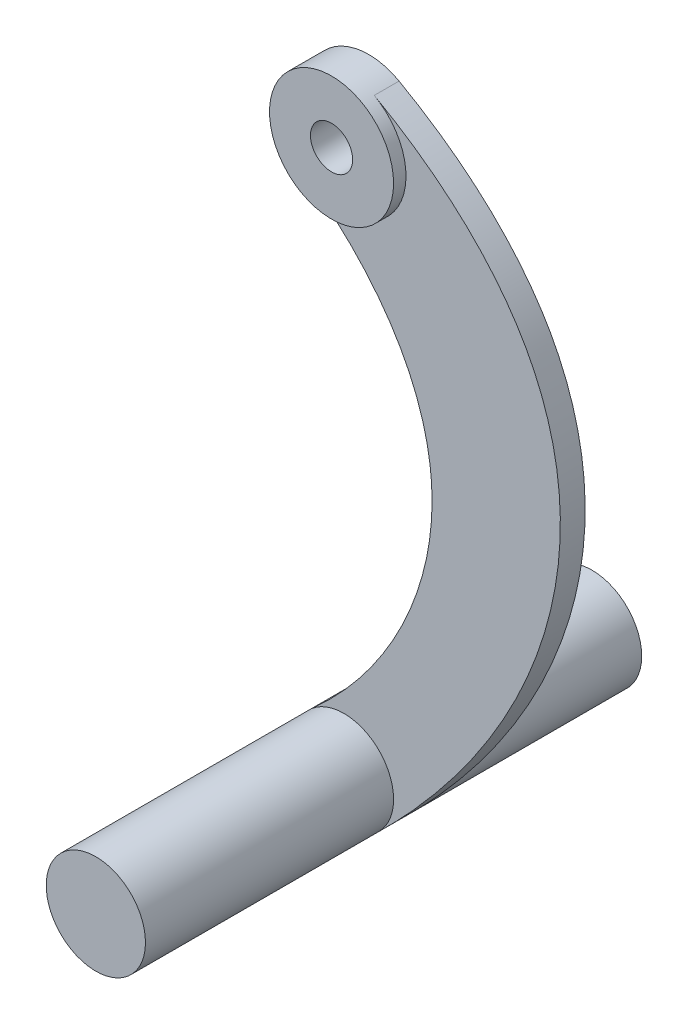
ISO-10303-21;
HEADER;
FILE_DESCRIPTION(('STEP AP214'),'2;1');
FILE_NAME('part.step','',(''),(''),'','','');
FILE_SCHEMA(('AUTOMOTIVE_DESIGN { 1 0 10303 214 1 1 1 1 }'));
ENDSEC;
DATA;
#1=APPLICATION_CONTEXT('core data for automotive mechanical design processes');
#2=APPLICATION_PROTOCOL_DEFINITION('international standard','automotive_design',2000,#1);
#3=PRODUCT_CONTEXT('',#1,'mechanical');
#4=PRODUCT('Part','Part','',(#3));
#5=PRODUCT_RELATED_PRODUCT_CATEGORY('part','',(#4));
#6=PRODUCT_DEFINITION_FORMATION('','',#4);
#7=PRODUCT_DEFINITION_CONTEXT('part definition',#1,'design');
#8=PRODUCT_DEFINITION('design','',#6,#7);
#9=PRODUCT_DEFINITION_SHAPE('','',#8);
#10=(LENGTH_UNIT() NAMED_UNIT(*) SI_UNIT(.MILLI.,.METRE.));
#11=(NAMED_UNIT(*) PLANE_ANGLE_UNIT() SI_UNIT($,.RADIAN.));
#12=(NAMED_UNIT(*) SI_UNIT($,.STERADIAN.) SOLID_ANGLE_UNIT());
#13=UNCERTAINTY_MEASURE_WITH_UNIT(LENGTH_MEASURE(1.E-05),#10,'distance_accuracy_value','');
#14=(GEOMETRIC_REPRESENTATION_CONTEXT(3) GLOBAL_UNCERTAINTY_ASSIGNED_CONTEXT((#13)) GLOBAL_UNIT_ASSIGNED_CONTEXT((#10,
#11,#12)) REPRESENTATION_CONTEXT('',''));
#15=CARTESIAN_POINT('',(0.,0.,0.));
#16=DIRECTION('',(0.,0.,1.));
#17=DIRECTION('',(1.,0.,0.));
#18=AXIS2_PLACEMENT_3D('',#15,#16,#17);
#19=CARTESIAN_POINT('',(0.,0.,2.5));
#20=DIRECTION('',(0.,0.,1.));
#21=DIRECTION('',(1.,0.,0.));
#22=AXIS2_PLACEMENT_3D('',#19,#20,#21);
#23=PLANE('',#22);
#24=CARTESIAN_POINT('',(0.,0.,2.5));
#25=DIRECTION('',(0.,0.,1.));
#26=DIRECTION('',(1.,0.,0.));
#27=AXIS2_PLACEMENT_3D('',#24,#25,#26);
#28=CIRCLE('',#27,12.5);
#29=CARTESIAN_POINT('',(12.5,0.,2.5));
#30=VERTEX_POINT('',#29);
#31=EDGE_CURVE('E44',#30,#30,#28,.T.);
#32=ORIENTED_EDGE('',*,*,#31,.T.);
#33=EDGE_LOOP('',(#32));
#34=FACE_BOUND('',#33,.T.);
#35=CARTESIAN_POINT('',(0.,0.,2.5));
#36=DIRECTION('',(0.,0.,1.));
#37=DIRECTION('',(1.,0.,0.));
#38=AXIS2_PLACEMENT_3D('',#35,#36,#37);
#39=CIRCLE('',#38,4.25);
#40=CARTESIAN_POINT('',(4.25,0.,2.5));
#41=VERTEX_POINT('',#40);
#42=EDGE_CURVE('E96',#41,#41,#39,.T.);
#43=ORIENTED_EDGE('',*,*,#42,.F.);
#44=EDGE_LOOP('',(#43));
#45=FACE_BOUND('',#44,.T.);
#46=ADVANCED_FACE('F35',(#34,#45),#23,.T.);
#47=CARTESIAN_POINT('',(0.,0.,2.5));
#48=DIRECTION('',(0.,0.,-1.));
#49=DIRECTION('',(-1.,0.,0.));
#50=AXIS2_PLACEMENT_3D('',#47,#48,#49);
#51=CYLINDRICAL_SURFACE('',#50,12.5);
#52=ORIENTED_EDGE('',*,*,#31,.F.);
#53=EDGE_LOOP('',(#52));
#54=FACE_BOUND('',#53,.T.);
#55=CARTESIAN_POINT('',(0.,0.,0.));
#56=DIRECTION('',(0.,0.,1.));
#57=DIRECTION('',(1.,0.,0.));
#58=AXIS2_PLACEMENT_3D('',#55,#56,#57);
#59=CIRCLE('',#58,12.5);
#60=CARTESIAN_POINT('',(-7.40681903297774,-10.0692120750692,0.));
#61=VERTEX_POINT('',#60);
#62=CARTESIAN_POINT('',(6.10639637499908,10.9069667328455,0.));
#63=VERTEX_POINT('',#62);
#64=EDGE_CURVE('E71',#61,#63,#59,.T.);
#65=ORIENTED_EDGE('',*,*,#64,.T.);
#66=DIRECTION('',(0.,0.,1.));
#67=VECTOR('',#66,1.);
#68=CARTESIAN_POINT('',(6.10639637499908,10.9069667328455,-5.));
#69=LINE('',#68,#67);
#70=CARTESIAN_POINT('',(6.10639637499908,10.9069667328455,-5.));
#71=VERTEX_POINT('',#70);
#72=EDGE_CURVE('E108',#71,#63,#69,.T.);
#73=ORIENTED_EDGE('',*,*,#72,.F.);
#74=CARTESIAN_POINT('',(0.,0.,-5.));
#75=DIRECTION('',(0.,0.,-1.));
#76=DIRECTION('',(1.,0.,0.));
#77=AXIS2_PLACEMENT_3D('',#74,#75,#76);
#78=CIRCLE('',#77,12.5);
#79=CARTESIAN_POINT('',(-7.40681903297774,-10.0692120750692,-5.));
#80=VERTEX_POINT('',#79);
#81=EDGE_CURVE('E60',#80,#71,#78,.T.);
#82=ORIENTED_EDGE('',*,*,#81,.F.);
#83=DIRECTION('',(0.,0.,1.));
#84=VECTOR('',#83,1.);
#85=CARTESIAN_POINT('',(-7.40681903297774,-10.0692120750692,-5.));
#86=LINE('',#85,#84);
#87=EDGE_CURVE('E100',#80,#61,#86,.T.);
#88=ORIENTED_EDGE('',*,*,#87,.T.);
#89=EDGE_LOOP('',(#65,#73,#82,#88));
#90=FACE_BOUND('',#89,.T.);
#91=ADVANCED_FACE('F37',(#54,#90),#51,.T.);
#92=CARTESIAN_POINT('',(0.,0.,2.5));
#93=DIRECTION('',(0.,0.,-1.));
#94=DIRECTION('',(-1.,0.,0.));
#95=AXIS2_PLACEMENT_3D('',#92,#93,#94);
#96=CYLINDRICAL_SURFACE('',#95,4.25);
#97=ORIENTED_EDGE('',*,*,#42,.T.);
#98=EDGE_LOOP('',(#97));
#99=FACE_BOUND('',#98,.T.);
#100=CARTESIAN_POINT('',(0.,0.,-5.));
#101=DIRECTION('',(0.,0.,1.));
#102=DIRECTION('',(1.,0.,0.));
#103=AXIS2_PLACEMENT_3D('',#100,#101,#102);
#104=CIRCLE('',#103,4.25);
#105=CARTESIAN_POINT('',(4.25,0.,-5.));
#106=VERTEX_POINT('',#105);
#107=EDGE_CURVE('E39',#106,#106,#104,.T.);
#108=ORIENTED_EDGE('',*,*,#107,.F.);
#109=EDGE_LOOP('',(#108));
#110=FACE_BOUND('',#109,.T.);
#111=ADVANCED_FACE('F148',(#99,#110),#96,.F.);
#112=CARTESIAN_POINT('',(43.6075840108777,-45.5726391576003,0.));
#113=DIRECTION('',(0.,0.,1.));
#114=DIRECTION('',(1.,0.,0.));
#115=AXIS2_PLACEMENT_3D('',#112,#113,#114);
#116=PLANE('',#115);
#117=CARTESIAN_POINT('',(0.,-110.,0.));
#118=DIRECTION('',(0.,0.,1.));
#119=DIRECTION('',(1.,0.,0.));
#120=AXIS2_PLACEMENT_3D('',#117,#118,#119);
#121=CIRCLE('',#120,10.);
#122=CARTESIAN_POINT('',(7.00278738043043,-117.138695182208,0.));
#123=VERTEX_POINT('',#122);
#124=CARTESIAN_POINT('',(-6.61109426102791,-102.497105047263,0.));
#125=VERTEX_POINT('',#124);
#126=EDGE_CURVE('E122',#123,#125,#121,.T.);
#127=ORIENTED_EDGE('',*,*,#126,.F.);
#128=CARTESIAN_POINT('',(6.10639637499908,10.9069667328455,0.));
#129=CARTESIAN_POINT('',(20.6217154745296,2.78039093020672,0.));
#130=CARTESIAN_POINT('',(57.0301345845801,-32.0145116065053,0.));
#131=CARTESIAN_POINT('',(40.0030167539701,-84.7667302908812,0.));
#132=CARTESIAN_POINT('',(7.00278738043043,-117.138695182208,0.));
#133=B_SPLINE_CURVE_WITH_KNOTS('',3,(#128,#129,#130,#131,#132),.UNSPECIFIED.,.F.,.F.,(4,1,4),
(0.,0.302024189691498,1.),.UNSPECIFIED.);
#134=EDGE_CURVE('E51',#63,#123,#133,.T.);
#135=ORIENTED_EDGE('',*,*,#134,.F.);
#136=ORIENTED_EDGE('',*,*,#64,.F.);
#137=CARTESIAN_POINT('',(-6.61109426102791,-102.497105047263,0.));
#138=CARTESIAN_POINT('',(9.43979398382763,-88.3540394934456,0.));
#139=CARTESIAN_POINT('',(26.8557304346869,-52.6462833363687,0.));
#140=CARTESIAN_POINT('',(7.97990750459093,-21.3875454385965,0.));
#141=CARTESIAN_POINT('',(-7.40681903297774,-10.0692120750692,0.));
#142=B_SPLINE_CURVE_WITH_KNOTS('',3,(#137,#138,#139,#140,#141),.UNSPECIFIED.,.F.,.F.,(4,1,4),
(0.,0.544178010848037,1.),.UNSPECIFIED.);
#143=EDGE_CURVE('E93',#125,#61,#142,.T.);
#144=ORIENTED_EDGE('',*,*,#143,.F.);
#145=EDGE_LOOP('',(#127,#135,#136,#144));
#146=FACE_BOUND('',#145,.T.);
#147=ADVANCED_FACE('F142',(#146),#116,.T.);
#148=CARTESIAN_POINT('',(6.10639637499908,10.9069667328455,-5.));
#149=CARTESIAN_POINT('',(20.6217154745296,2.78039093020672,-5.));
#150=CARTESIAN_POINT('',(57.0301345845801,-32.0145116065053,-5.));
#151=CARTESIAN_POINT('',(40.0030167539701,-84.7667302908812,-5.));
#152=CARTESIAN_POINT('',(7.00278738043043,-117.138695182208,-5.));
#153=B_SPLINE_CURVE_WITH_KNOTS('',3,(#148,#149,#150,#151,#152),.UNSPECIFIED.,.F.,.F.,(4,1,4),
(0.,0.302024189691498,1.),.UNSPECIFIED.);
#154=DIRECTION('',(0.,0.,1.));
#155=VECTOR('',#154,1.);
#156=SURFACE_OF_LINEAR_EXTRUSION('',#153,#155);
#157=ORIENTED_EDGE('',*,*,#134,.T.);
#158=DIRECTION('',(0.,0.,1.));
#159=VECTOR('',#158,1.);
#160=CARTESIAN_POINT('',(7.00278738043043,-117.138695182208,-5.));
#161=LINE('',#160,#159);
#162=CARTESIAN_POINT('',(7.00278738043043,-117.138695182208,-5.));
#163=VERTEX_POINT('',#162);
#164=EDGE_CURVE('E84',#163,#123,#161,.T.);
#165=ORIENTED_EDGE('',*,*,#164,.F.);
#166=EDGE_CURVE('E89',#71,#163,#153,.T.);
#167=ORIENTED_EDGE('',*,*,#166,.F.);
#168=ORIENTED_EDGE('',*,*,#72,.T.);
#169=EDGE_LOOP('',(#157,#165,#167,#168));
#170=FACE_BOUND('',#169,.T.);
#171=ADVANCED_FACE('F95',(#170),#156,.F.);
#172=CARTESIAN_POINT('',(0.,-110.,-5.));
#173=DIRECTION('',(0.,0.,1.));
#174=DIRECTION('',(1.,0.,0.));
#175=AXIS2_PLACEMENT_3D('',#172,#173,#174);
#176=CYLINDRICAL_SURFACE('',#175,10.);
#177=ORIENTED_EDGE('',*,*,#164,.T.);
#178=ORIENTED_EDGE('',*,*,#126,.T.);
#179=DIRECTION('',(0.,0.,1.));
#180=VECTOR('',#179,1.);
#181=CARTESIAN_POINT('',(-6.61109426102791,-102.497105047263,-5.));
#182=LINE('',#181,#180);
#183=CARTESIAN_POINT('',(-6.61109426102791,-102.497105047263,-5.));
#184=VERTEX_POINT('',#183);
#185=EDGE_CURVE('E86',#184,#125,#182,.T.);
#186=ORIENTED_EDGE('',*,*,#185,.F.);
#187=CARTESIAN_POINT('',(0.,-110.,-5.));
#188=DIRECTION('',(0.,0.,1.));
#189=DIRECTION('',(1.,0.,0.));
#190=AXIS2_PLACEMENT_3D('',#187,#188,#189);
#191=CIRCLE('',#190,10.);
#192=EDGE_CURVE('E11',#163,#184,#191,.T.);
#193=ORIENTED_EDGE('',*,*,#192,.F.);
#194=EDGE_LOOP('',(#177,#178,#186,#193));
#195=FACE_BOUND('',#194,.T.);
#196=CARTESIAN_POINT('',(0.,-110.,-50.));
#197=DIRECTION('',(0.,0.,1.));
#198=DIRECTION('',(1.,0.,0.));
#199=AXIS2_PLACEMENT_3D('',#196,#197,#198);
#200=CIRCLE('',#199,10.);
#201=CARTESIAN_POINT('',(10.,-110.,-50.));
#202=VERTEX_POINT('',#201);
#203=EDGE_CURVE('E166',#202,#202,#200,.T.);
#204=ORIENTED_EDGE('',*,*,#203,.T.);
#205=EDGE_LOOP('',(#204));
#206=FACE_BOUND('',#205,.T.);
#207=CARTESIAN_POINT('',(0.,-110.,50.));
#208=DIRECTION('',(0.,0.,1.));
#209=DIRECTION('',(1.,0.,0.));
#210=AXIS2_PLACEMENT_3D('',#207,#208,#209);
#211=CIRCLE('',#210,10.);
#212=CARTESIAN_POINT('',(10.,-110.,50.));
#213=VERTEX_POINT('',#212);
#214=EDGE_CURVE('E164',#213,#213,#211,.T.);
#215=ORIENTED_EDGE('',*,*,#214,.F.);
#216=EDGE_LOOP('',(#215));
#217=FACE_BOUND('',#216,.T.);
#218=ADVANCED_FACE('F80',(#195,#206,#217),#176,.T.);
#219=CARTESIAN_POINT('',(-6.61109426102791,-102.497105047263,-5.));
#220=CARTESIAN_POINT('',(9.43979398382763,-88.3540394934456,-5.));
#221=CARTESIAN_POINT('',(26.8557304346869,-52.6462833363687,-5.));
#222=CARTESIAN_POINT('',(7.97990750459093,-21.3875454385965,-5.));
#223=CARTESIAN_POINT('',(-7.40681903297774,-10.0692120750692,-5.));
#224=B_SPLINE_CURVE_WITH_KNOTS('',3,(#219,#220,#221,#222,#223),.UNSPECIFIED.,.F.,.F.,(4,1,4),
(0.,0.544178010848037,1.),.UNSPECIFIED.);
#225=DIRECTION('',(0.,0.,1.));
#226=VECTOR('',#225,1.);
#227=SURFACE_OF_LINEAR_EXTRUSION('',#224,#226);
#228=ORIENTED_EDGE('',*,*,#143,.T.);
#229=ORIENTED_EDGE('',*,*,#87,.F.);
#230=EDGE_CURVE('E92',#184,#80,#224,.T.);
#231=ORIENTED_EDGE('',*,*,#230,.F.);
#232=ORIENTED_EDGE('',*,*,#185,.T.);
#233=EDGE_LOOP('',(#228,#229,#231,#232));
#234=FACE_BOUND('',#233,.T.);
#235=ADVANCED_FACE('F138',(#234),#227,.F.);
#236=CARTESIAN_POINT('',(43.6075840108777,-45.5726391576003,-5.));
#237=DIRECTION('',(0.,0.,1.));
#238=DIRECTION('',(1.,0.,0.));
#239=AXIS2_PLACEMENT_3D('',#236,#237,#238);
#240=PLANE('',#239);
#241=ORIENTED_EDGE('',*,*,#107,.T.);
#242=EDGE_LOOP('',(#241));
#243=FACE_BOUND('',#242,.T.);
#244=ORIENTED_EDGE('',*,*,#166,.T.);
#245=ORIENTED_EDGE('',*,*,#192,.T.);
#246=ORIENTED_EDGE('',*,*,#230,.T.);
#247=ORIENTED_EDGE('',*,*,#81,.T.);
#248=EDGE_LOOP('',(#244,#245,#246,#247));
#249=FACE_BOUND('',#248,.T.);
#250=ADVANCED_FACE('F90',(#243,#249),#240,.F.);
#251=CARTESIAN_POINT('',(0.,-110.,-50.));
#252=DIRECTION('',(0.,0.,1.));
#253=DIRECTION('',(1.,0.,0.));
#254=AXIS2_PLACEMENT_3D('',#251,#252,#253);
#255=PLANE('',#254);
#256=ORIENTED_EDGE('',*,*,#203,.F.);
#257=EDGE_LOOP('',(#256));
#258=FACE_BOUND('',#257,.T.);
#259=ADVANCED_FACE('F197',(#258),#255,.F.);
#260=CARTESIAN_POINT('',(0.,-110.,50.));
#261=DIRECTION('',(0.,0.,1.));
#262=DIRECTION('',(1.,0.,0.));
#263=AXIS2_PLACEMENT_3D('',#260,#261,#262);
#264=PLANE('',#263);
#265=ORIENTED_EDGE('',*,*,#214,.T.);
#266=EDGE_LOOP('',(#265));
#267=FACE_BOUND('',#266,.T.);
#268=ADVANCED_FACE('F202',(#267),#264,.T.);
#269=CLOSED_SHELL('',(#46,#91,#111,#147,#171,#218,#235,#250,#259,#268));
#270=MANIFOLD_SOLID_BREP('B2',#269);
#271=ADVANCED_BREP_SHAPE_REPRESENTATION('',(#18,#270),#14);
#272=SHAPE_DEFINITION_REPRESENTATION(#9,#271);
ENDSEC;
END-ISO-10303-21;
